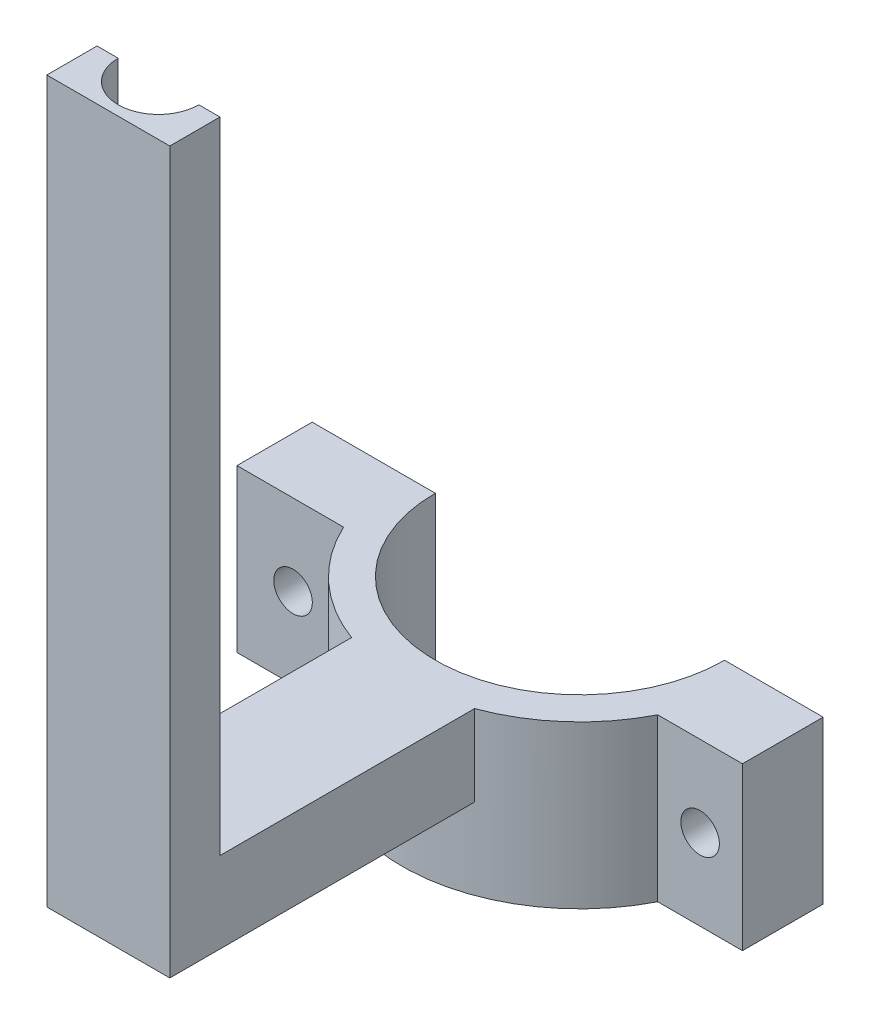
ISO-10303-21;
HEADER;
FILE_DESCRIPTION(('STEP AP214'),'2;1');
FILE_NAME('part.step','',(''),(''),'','','');
FILE_SCHEMA(('AUTOMOTIVE_DESIGN { 1 0 10303 214 1 1 1 1 }'));
ENDSEC;
DATA;
#1=APPLICATION_CONTEXT('core data for automotive mechanical design processes');
#2=APPLICATION_PROTOCOL_DEFINITION('international standard','automotive_design',2000,#1);
#3=PRODUCT_CONTEXT('',#1,'mechanical');
#4=PRODUCT('Part','Part','',(#3));
#5=PRODUCT_RELATED_PRODUCT_CATEGORY('part','',(#4));
#6=PRODUCT_DEFINITION_FORMATION('','',#4);
#7=PRODUCT_DEFINITION_CONTEXT('part definition',#1,'design');
#8=PRODUCT_DEFINITION('design','',#6,#7);
#9=PRODUCT_DEFINITION_SHAPE('','',#8);
#10=(LENGTH_UNIT() NAMED_UNIT(*) SI_UNIT(.MILLI.,.METRE.));
#11=(NAMED_UNIT(*) PLANE_ANGLE_UNIT() SI_UNIT($,.RADIAN.));
#12=(NAMED_UNIT(*) SI_UNIT($,.STERADIAN.) SOLID_ANGLE_UNIT());
#13=UNCERTAINTY_MEASURE_WITH_UNIT(LENGTH_MEASURE(1.E-05),#10,'distance_accuracy_value','');
#14=(GEOMETRIC_REPRESENTATION_CONTEXT(3) GLOBAL_UNCERTAINTY_ASSIGNED_CONTEXT((#13)) GLOBAL_UNIT_ASSIGNED_CONTEXT((#10,
#11,#12)) REPRESENTATION_CONTEXT('',''));
#15=CARTESIAN_POINT('',(0.,0.,0.));
#16=DIRECTION('',(0.,0.,1.));
#17=DIRECTION('',(1.,0.,0.));
#18=AXIS2_PLACEMENT_3D('',#15,#16,#17);
#19=CARTESIAN_POINT('',(0.,16.05,0.));
#20=DIRECTION('',(0.,-1.,0.));
#21=DIRECTION('',(0.,0.,-1.));
#22=AXIS2_PLACEMENT_3D('',#19,#20,#21);
#23=CYLINDRICAL_SURFACE('',#22,17.63);
#24=CARTESIAN_POINT('',(0.,16.05,0.));
#25=DIRECTION('',(0.,1.,0.));
#26=DIRECTION('',(1.,0.,0.));
#27=AXIS2_PLACEMENT_3D('',#24,#25,#26);
#28=CIRCLE('',#27,17.63);
#29=CARTESIAN_POINT('',(-15.9755493799721,16.05,7.45645505639727));
#30=VERTEX_POINT('',#29);
#31=CARTESIAN_POINT('',(-6.095,16.05,16.5429101127945));
#32=VERTEX_POINT('',#31);
#33=EDGE_CURVE('E255',#30,#32,#28,.T.);
#34=ORIENTED_EDGE('',*,*,#33,.F.);
#35=DIRECTION('',(0.,-1.,0.));
#36=VECTOR('',#35,1.);
#37=CARTESIAN_POINT('',(-15.9755493799721,16.05,7.45645505639727));
#38=LINE('',#37,#36);
#39=CARTESIAN_POINT('',(-15.9755493799721,0.,7.45645505639727));
#40=VERTEX_POINT('',#39);
#41=EDGE_CURVE('E272',#30,#40,#38,.T.);
#42=ORIENTED_EDGE('',*,*,#41,.T.);
#43=CARTESIAN_POINT('',(0.,0.,0.));
#44=DIRECTION('',(0.,1.,0.));
#45=DIRECTION('',(1.,0.,0.));
#46=AXIS2_PLACEMENT_3D('',#43,#44,#45);
#47=CIRCLE('',#46,17.63);
#48=CARTESIAN_POINT('',(15.7104073785501,0.,8.));
#49=VERTEX_POINT('',#48);
#50=EDGE_CURVE('E252',#40,#49,#47,.T.);
#51=ORIENTED_EDGE('',*,*,#50,.T.);
#52=DIRECTION('',(0.,-1.,0.));
#53=VECTOR('',#52,1.);
#54=CARTESIAN_POINT('',(15.7104073785501,16.05,8.));
#55=LINE('',#54,#53);
#56=CARTESIAN_POINT('',(15.7104073785501,16.05,8.));
#57=VERTEX_POINT('',#56);
#58=EDGE_CURVE('E258',#49,#57,#55,.F.);
#59=ORIENTED_EDGE('',*,*,#58,.T.);
#60=CARTESIAN_POINT('',(6.095,16.05,16.5429101127945));
#61=VERTEX_POINT('',#60);
#62=EDGE_CURVE('E259',#61,#57,#28,.T.);
#63=ORIENTED_EDGE('',*,*,#62,.F.);
#64=DIRECTION('',(0.,-1.,0.));
#65=VECTOR('',#64,1.);
#66=CARTESIAN_POINT('',(6.095,16.05,16.5429101127945));
#67=LINE('',#66,#65);
#68=CARTESIAN_POINT('',(6.095,8.025,16.5429101127945));
#69=VERTEX_POINT('',#68);
#70=EDGE_CURVE('E269',#61,#69,#67,.T.);
#71=ORIENTED_EDGE('',*,*,#70,.T.);
#72=CARTESIAN_POINT('',(0.,8.025,0.));
#73=DIRECTION('',(0.,-1.,0.));
#74=DIRECTION('',(0.,0.,-1.));
#75=AXIS2_PLACEMENT_3D('',#72,#73,#74);
#76=CIRCLE('',#75,17.63);
#77=CARTESIAN_POINT('',(-6.095,8.025,16.5429101127945));
#78=VERTEX_POINT('',#77);
#79=EDGE_CURVE('E266',#69,#78,#76,.T.);
#80=ORIENTED_EDGE('',*,*,#79,.T.);
#81=DIRECTION('',(0.,-1.,0.));
#82=VECTOR('',#81,1.);
#83=CARTESIAN_POINT('',(-6.095,16.05,16.5429101127945));
#84=LINE('',#83,#82);
#85=EDGE_CURVE('E263',#78,#32,#84,.F.);
#86=ORIENTED_EDGE('',*,*,#85,.T.);
#87=EDGE_LOOP('',(#34,#42,#51,#59,#63,#71,#80,#86));
#88=FACE_BOUND('',#87,.T.);
#89=ADVANCED_FACE('F40',(#88),#23,.T.);
#90=CARTESIAN_POINT('',(0.,16.05,0.));
#91=DIRECTION('',(0.,1.,0.));
#92=DIRECTION('',(0.,0.,1.));
#93=AXIS2_PLACEMENT_3D('',#90,#91,#92);
#94=PLANE('',#93);
#95=ORIENTED_EDGE('',*,*,#33,.T.);
#96=DIRECTION('',(0.,0.,1.));
#97=VECTOR('',#96,1.);
#98=CARTESIAN_POINT('',(-6.095,16.05,14.98));
#99=LINE('',#98,#97);
#100=CARTESIAN_POINT('',(-6.095,16.05,41.7733725275192));
#101=VERTEX_POINT('',#100);
#102=EDGE_CURVE('E282',#32,#101,#99,.T.);
#103=ORIENTED_EDGE('',*,*,#102,.T.);
#104=DIRECTION('',(-1.,0.,0.));
#105=VECTOR('',#104,1.);
#106=CARTESIAN_POINT('',(18.905,16.05,41.7733725275192));
#107=LINE('',#106,#105);
#108=CARTESIAN_POINT('',(6.095,16.05,41.7733725275192));
#109=VERTEX_POINT('',#108);
#110=EDGE_CURVE('E170',#109,#101,#107,.T.);
#111=ORIENTED_EDGE('',*,*,#110,.F.);
#112=DIRECTION('',(0.,0.,-1.));
#113=VECTOR('',#112,1.);
#114=CARTESIAN_POINT('',(6.095,16.05,14.98));
#115=LINE('',#114,#113);
#116=EDGE_CURVE('E168',#109,#61,#115,.T.);
#117=ORIENTED_EDGE('',*,*,#116,.T.);
#118=ORIENTED_EDGE('',*,*,#62,.T.);
#119=DIRECTION('',(1.,0.,0.));
#120=VECTOR('',#119,1.);
#121=CARTESIAN_POINT('',(14.75,16.05,8.));
#122=LINE('',#121,#120);
#123=CARTESIAN_POINT('',(24.11,16.05,8.));
#124=VERTEX_POINT('',#123);
#125=EDGE_CURVE('E242',#57,#124,#122,.T.);
#126=ORIENTED_EDGE('',*,*,#125,.T.);
#127=DIRECTION('',(0.,0.,1.));
#128=VECTOR('',#127,1.);
#129=CARTESIAN_POINT('',(24.11,16.05,-8.));
#130=LINE('',#129,#128);
#131=CARTESIAN_POINT('',(24.11,16.05,0.));
#132=VERTEX_POINT('',#131);
#133=EDGE_CURVE('E235',#132,#124,#130,.T.);
#134=ORIENTED_EDGE('',*,*,#133,.F.);
#135=DIRECTION('',(1.,0.,0.));
#136=VECTOR('',#135,1.);
#137=CARTESIAN_POINT('',(24.11,16.05,0.));
#138=LINE('',#137,#136);
#139=CARTESIAN_POINT('',(14.34,16.05,0.));
#140=VERTEX_POINT('',#139);
#141=EDGE_CURVE('E189',#140,#132,#138,.T.);
#142=ORIENTED_EDGE('',*,*,#141,.F.);
#143=CARTESIAN_POINT('',(0.,16.05,0.));
#144=DIRECTION('',(0.,1.,0.));
#145=DIRECTION('',(0.,0.,1.));
#146=AXIS2_PLACEMENT_3D('',#143,#144,#145);
#147=CIRCLE('',#146,14.34);
#148=CARTESIAN_POINT('',(-14.34,16.05,0.));
#149=VERTEX_POINT('',#148);
#150=EDGE_CURVE('E249',#149,#140,#147,.T.);
#151=ORIENTED_EDGE('',*,*,#150,.F.);
#152=CARTESIAN_POINT('',(-26.54,16.05,0.));
#153=VERTEX_POINT('',#152);
#154=EDGE_CURVE('E194',#153,#149,#138,.T.);
#155=ORIENTED_EDGE('',*,*,#154,.F.);
#156=DIRECTION('',(0.,0.,-1.));
#157=VECTOR('',#156,1.);
#158=CARTESIAN_POINT('',(-26.54,16.05,-8.54354494360273));
#159=LINE('',#158,#157);
#160=CARTESIAN_POINT('',(-26.54,16.05,7.45645505639727));
#161=VERTEX_POINT('',#160);
#162=EDGE_CURVE('E213',#161,#153,#159,.T.);
#163=ORIENTED_EDGE('',*,*,#162,.F.);
#164=DIRECTION('',(1.,0.,0.));
#165=VECTOR('',#164,1.);
#166=CARTESIAN_POINT('',(-27.75,16.05,7.45645505639727));
#167=LINE('',#166,#165);
#168=EDGE_CURVE('E222',#161,#30,#167,.T.);
#169=ORIENTED_EDGE('',*,*,#168,.T.);
#170=EDGE_LOOP('',(#95,#103,#111,#117,#118,#126,#134,#142,#151,#155,#163,#169));
#171=FACE_BOUND('',#170,.T.);
#172=ADVANCED_FACE('F295',(#171),#94,.T.);
#173=CARTESIAN_POINT('',(0.,0.,0.));
#174=DIRECTION('',(0.,1.,0.));
#175=DIRECTION('',(0.,0.,1.));
#176=AXIS2_PLACEMENT_3D('',#173,#174,#175);
#177=PLANE('',#176);
#178=DIRECTION('',(0.,0.,-1.));
#179=VECTOR('',#178,1.);
#180=CARTESIAN_POINT('',(-26.54,0.,-8.54354494360273));
#181=LINE('',#180,#179);
#182=CARTESIAN_POINT('',(-26.54,0.,7.45645505639727));
#183=VERTEX_POINT('',#182);
#184=CARTESIAN_POINT('',(-26.54,0.,0.));
#185=VERTEX_POINT('',#184);
#186=EDGE_CURVE('E214',#183,#185,#181,.T.);
#187=ORIENTED_EDGE('',*,*,#186,.T.);
#188=DIRECTION('',(1.,0.,0.));
#189=VECTOR('',#188,1.);
#190=CARTESIAN_POINT('',(24.11,0.,0.));
#191=LINE('',#190,#189);
#192=CARTESIAN_POINT('',(-14.34,0.,0.));
#193=VERTEX_POINT('',#192);
#194=EDGE_CURVE('E193',#185,#193,#191,.T.);
#195=ORIENTED_EDGE('',*,*,#194,.T.);
#196=CARTESIAN_POINT('',(0.,0.,0.));
#197=DIRECTION('',(0.,1.,0.));
#198=DIRECTION('',(0.,0.,1.));
#199=AXIS2_PLACEMENT_3D('',#196,#197,#198);
#200=CIRCLE('',#199,14.34);
#201=CARTESIAN_POINT('',(14.34,0.,0.));
#202=VERTEX_POINT('',#201);
#203=EDGE_CURVE('E246',#193,#202,#200,.T.);
#204=ORIENTED_EDGE('',*,*,#203,.T.);
#205=CARTESIAN_POINT('',(24.11,0.,0.));
#206=VERTEX_POINT('',#205);
#207=EDGE_CURVE('E190',#202,#206,#191,.T.);
#208=ORIENTED_EDGE('',*,*,#207,.T.);
#209=DIRECTION('',(0.,0.,1.));
#210=VECTOR('',#209,1.);
#211=CARTESIAN_POINT('',(24.11,0.,-8.));
#212=LINE('',#211,#210);
#213=CARTESIAN_POINT('',(24.11,0.,8.));
#214=VERTEX_POINT('',#213);
#215=EDGE_CURVE('E236',#206,#214,#212,.T.);
#216=ORIENTED_EDGE('',*,*,#215,.T.);
#217=DIRECTION('',(1.,0.,0.));
#218=VECTOR('',#217,1.);
#219=CARTESIAN_POINT('',(14.75,0.,8.));
#220=LINE('',#219,#218);
#221=EDGE_CURVE('E243',#49,#214,#220,.T.);
#222=ORIENTED_EDGE('',*,*,#221,.F.);
#223=ORIENTED_EDGE('',*,*,#50,.F.);
#224=DIRECTION('',(1.,0.,0.));
#225=VECTOR('',#224,1.);
#226=CARTESIAN_POINT('',(-27.75,0.,7.45645505639727));
#227=LINE('',#226,#225);
#228=EDGE_CURVE('E221',#183,#40,#227,.T.);
#229=ORIENTED_EDGE('',*,*,#228,.F.);
#230=EDGE_LOOP('',(#187,#195,#204,#208,#216,#222,#223,#229));
#231=FACE_BOUND('',#230,.T.);
#232=ADVANCED_FACE('F327',(#231),#177,.F.);
#233=CARTESIAN_POINT('',(0.,16.05,0.));
#234=DIRECTION('',(0.,-1.,0.));
#235=DIRECTION('',(0.,0.,-1.));
#236=AXIS2_PLACEMENT_3D('',#233,#234,#235);
#237=CYLINDRICAL_SURFACE('',#236,14.34);
#238=DIRECTION('',(0.,-1.,0.));
#239=VECTOR('',#238,1.);
#240=CARTESIAN_POINT('',(-14.34,16.05,0.));
#241=LINE('',#240,#239);
#242=EDGE_CURVE('E208',#149,#193,#241,.T.);
#243=ORIENTED_EDGE('',*,*,#242,.F.);
#244=ORIENTED_EDGE('',*,*,#150,.T.);
#245=DIRECTION('',(0.,-1.,0.));
#246=VECTOR('',#245,1.);
#247=CARTESIAN_POINT('',(14.34,16.05,0.));
#248=LINE('',#247,#246);
#249=EDGE_CURVE('E206',#202,#140,#248,.F.);
#250=ORIENTED_EDGE('',*,*,#249,.F.);
#251=ORIENTED_EDGE('',*,*,#203,.F.);
#252=EDGE_LOOP('',(#243,#244,#250,#251));
#253=FACE_BOUND('',#252,.T.);
#254=ADVANCED_FACE('F320',(#253),#237,.F.);
#255=CARTESIAN_POINT('',(14.75,16.05,8.));
#256=DIRECTION('',(0.,0.,1.));
#257=DIRECTION('',(1.,0.,0.));
#258=AXIS2_PLACEMENT_3D('',#255,#256,#257);
#259=PLANE('',#258);
#260=CARTESIAN_POINT('',(19.9102036892766,8.02500000000175,8.));
#261=DIRECTION('',(0.,0.,1.));
#262=DIRECTION('',(1.,0.,0.));
#263=AXIS2_PLACEMENT_3D('',#260,#261,#262);
#264=CIRCLE('',#263,1.91);
#265=CARTESIAN_POINT('',(21.8202036892766,8.02500000000175,8.));
#266=VERTEX_POINT('',#265);
#267=EDGE_CURVE('E231',#266,#266,#264,.T.);
#268=ORIENTED_EDGE('',*,*,#267,.F.);
#269=EDGE_LOOP('',(#268));
#270=FACE_BOUND('',#269,.T.);
#271=DIRECTION('',(0.,1.,0.));
#272=VECTOR('',#271,1.);
#273=CARTESIAN_POINT('',(24.11,0.,8.));
#274=LINE('',#273,#272);
#275=EDGE_CURVE('E238',#214,#124,#274,.T.);
#276=ORIENTED_EDGE('',*,*,#275,.T.);
#277=ORIENTED_EDGE('',*,*,#125,.F.);
#278=ORIENTED_EDGE('',*,*,#58,.F.);
#279=ORIENTED_EDGE('',*,*,#221,.T.);
#280=EDGE_LOOP('',(#276,#277,#278,#279));
#281=FACE_BOUND('',#280,.T.);
#282=ADVANCED_FACE('F307',(#270,#281),#259,.T.);
#283=CARTESIAN_POINT('',(24.11,0.,-8.));
#284=DIRECTION('',(-1.,0.,0.));
#285=DIRECTION('',(0.,0.,1.));
#286=AXIS2_PLACEMENT_3D('',#283,#284,#285);
#287=PLANE('',#286);
#288=ORIENTED_EDGE('',*,*,#215,.F.);
#289=DIRECTION('',(0.,1.,0.));
#290=VECTOR('',#289,1.);
#291=CARTESIAN_POINT('',(24.11,0.,0.));
#292=LINE('',#291,#290);
#293=EDGE_CURVE('E196',#206,#132,#292,.T.);
#294=ORIENTED_EDGE('',*,*,#293,.T.);
#295=ORIENTED_EDGE('',*,*,#133,.T.);
#296=ORIENTED_EDGE('',*,*,#275,.F.);
#297=EDGE_LOOP('',(#288,#294,#295,#296));
#298=FACE_BOUND('',#297,.T.);
#299=ADVANCED_FACE('F312',(#298),#287,.F.);
#300=CARTESIAN_POINT('',(19.9102036892766,8.02500000000175,-17.63));
#301=DIRECTION('',(0.,0.,1.));
#302=DIRECTION('',(1.,0.,0.));
#303=AXIS2_PLACEMENT_3D('',#300,#301,#302);
#304=CYLINDRICAL_SURFACE('',#303,1.91);
#305=CARTESIAN_POINT('',(19.9102036892766,8.02500000000175,0.));
#306=DIRECTION('',(0.,0.,1.));
#307=DIRECTION('',(1.,0.,0.));
#308=AXIS2_PLACEMENT_3D('',#305,#306,#307);
#309=CIRCLE('',#308,1.91);
#310=CARTESIAN_POINT('',(21.8202036892766,8.02500000000175,0.));
#311=VERTEX_POINT('',#310);
#312=EDGE_CURVE('E203',#311,#311,#309,.F.);
#313=ORIENTED_EDGE('',*,*,#312,.T.);
#314=EDGE_LOOP('',(#313));
#315=FACE_BOUND('',#314,.T.);
#316=ORIENTED_EDGE('',*,*,#267,.T.);
#317=EDGE_LOOP('',(#316));
#318=FACE_BOUND('',#317,.T.);
#319=ADVANCED_FACE('F344',(#315,#318),#304,.F.);
#320=CARTESIAN_POINT('',(6.095,16.2886259485937,14.98));
#321=DIRECTION('',(1.,0.,0.));
#322=DIRECTION('',(0.,1.,0.));
#323=AXIS2_PLACEMENT_3D('',#320,#321,#322);
#324=PLANE('',#323);
#325=DIRECTION('',(0.,-1.,0.));
#326=VECTOR('',#325,1.);
#327=CARTESIAN_POINT('',(6.095,16.2886259485937,41.7733725275192));
#328=LINE('',#327,#326);
#329=CARTESIAN_POINT('',(6.095,79.4486259485936,41.7733725275192));
#330=VERTEX_POINT('',#329);
#331=EDGE_CURVE('E166',#330,#109,#328,.T.);
#332=ORIENTED_EDGE('',*,*,#331,.F.);
#333=DIRECTION('',(0.,0.,-1.));
#334=VECTOR('',#333,1.);
#335=CARTESIAN_POINT('',(6.095,79.4486259485936,21.75));
#336=LINE('',#335,#334);
#337=CARTESIAN_POINT('',(6.095,79.4486259485936,46.75));
#338=VERTEX_POINT('',#337);
#339=EDGE_CURVE('E165',#338,#330,#336,.T.);
#340=ORIENTED_EDGE('',*,*,#339,.F.);
#341=DIRECTION('',(0.,1.,0.));
#342=VECTOR('',#341,1.);
#343=CARTESIAN_POINT('',(6.095,8.025,46.75));
#344=LINE('',#343,#342);
#345=CARTESIAN_POINT('',(6.095,8.025,46.75));
#346=VERTEX_POINT('',#345);
#347=EDGE_CURVE('E183',#346,#338,#344,.T.);
#348=ORIENTED_EDGE('',*,*,#347,.F.);
#349=DIRECTION('',(0.,0.,1.));
#350=VECTOR('',#349,1.);
#351=CARTESIAN_POINT('',(6.095,8.025,14.98));
#352=LINE('',#351,#350);
#353=EDGE_CURVE('E229',#69,#346,#352,.T.);
#354=ORIENTED_EDGE('',*,*,#353,.F.);
#355=ORIENTED_EDGE('',*,*,#70,.F.);
#356=ORIENTED_EDGE('',*,*,#116,.F.);
#357=EDGE_LOOP('',(#332,#340,#348,#354,#355,#356));
#358=FACE_BOUND('',#357,.T.);
#359=ADVANCED_FACE('F291',(#358),#324,.T.);
#360=CARTESIAN_POINT('',(-6.095,8.025,14.98));
#361=DIRECTION('',(0.,-1.,0.));
#362=DIRECTION('',(0.,0.,-1.));
#363=AXIS2_PLACEMENT_3D('',#360,#361,#362);
#364=PLANE('',#363);
#365=ORIENTED_EDGE('',*,*,#79,.F.);
#366=ORIENTED_EDGE('',*,*,#353,.T.);
#367=DIRECTION('',(1.,0.,0.));
#368=VECTOR('',#367,1.);
#369=CARTESIAN_POINT('',(-6.095,8.025,46.75));
#370=LINE('',#369,#368);
#371=CARTESIAN_POINT('',(-6.095,8.025,46.75));
#372=VERTEX_POINT('',#371);
#373=EDGE_CURVE('E180',#372,#346,#370,.T.);
#374=ORIENTED_EDGE('',*,*,#373,.F.);
#375=DIRECTION('',(0.,0.,1.));
#376=VECTOR('',#375,1.);
#377=CARTESIAN_POINT('',(-6.095,8.025,14.98));
#378=LINE('',#377,#376);
#379=EDGE_CURVE('E228',#78,#372,#378,.T.);
#380=ORIENTED_EDGE('',*,*,#379,.F.);
#381=EDGE_LOOP('',(#365,#366,#374,#380));
#382=FACE_BOUND('',#381,.T.);
#383=ADVANCED_FACE('F301',(#382),#364,.T.);
#384=CARTESIAN_POINT('',(-6.095,16.2886259485937,14.98));
#385=DIRECTION('',(-1.,0.,0.));
#386=DIRECTION('',(0.,-1.,0.));
#387=AXIS2_PLACEMENT_3D('',#384,#385,#386);
#388=PLANE('',#387);
#389=DIRECTION('',(0.,1.,0.));
#390=VECTOR('',#389,1.);
#391=CARTESIAN_POINT('',(-6.095,16.05,41.7733725275192));
#392=LINE('',#391,#390);
#393=CARTESIAN_POINT('',(-6.095,79.4486259485936,41.7733725275192));
#394=VERTEX_POINT('',#393);
#395=EDGE_CURVE('E173',#101,#394,#392,.T.);
#396=ORIENTED_EDGE('',*,*,#395,.F.);
#397=ORIENTED_EDGE('',*,*,#102,.F.);
#398=ORIENTED_EDGE('',*,*,#85,.F.);
#399=ORIENTED_EDGE('',*,*,#379,.T.);
#400=DIRECTION('',(0.,-1.,0.));
#401=VECTOR('',#400,1.);
#402=CARTESIAN_POINT('',(-6.095,8.025,46.75));
#403=LINE('',#402,#401);
#404=CARTESIAN_POINT('',(-6.095,79.4486259485936,46.75));
#405=VERTEX_POINT('',#404);
#406=EDGE_CURVE('E177',#405,#372,#403,.T.);
#407=ORIENTED_EDGE('',*,*,#406,.F.);
#408=DIRECTION('',(0.,0.,1.));
#409=VECTOR('',#408,1.);
#410=CARTESIAN_POINT('',(-6.095,79.4486259485936,21.75));
#411=LINE('',#410,#409);
#412=EDGE_CURVE('E224',#394,#405,#411,.T.);
#413=ORIENTED_EDGE('',*,*,#412,.F.);
#414=EDGE_LOOP('',(#396,#397,#398,#399,#407,#413));
#415=FACE_BOUND('',#414,.T.);
#416=ADVANCED_FACE('F284',(#415),#388,.T.);
#417=CARTESIAN_POINT('',(0.,79.4486259485936,0.));
#418=DIRECTION('',(0.,-1.,0.));
#419=DIRECTION('',(0.,0.,-1.));
#420=AXIS2_PLACEMENT_3D('',#417,#418,#419);
#421=PLANE('',#420);
#422=DIRECTION('',(-1.,0.,0.));
#423=VECTOR('',#422,1.);
#424=CARTESIAN_POINT('',(18.905,79.4486259485936,41.7733725275192));
#425=LINE('',#424,#423);
#426=CARTESIAN_POINT('',(4.,79.4486259485936,41.7733725275192));
#427=VERTEX_POINT('',#426);
#428=EDGE_CURVE('E159',#330,#427,#425,.T.);
#429=ORIENTED_EDGE('',*,*,#428,.T.);
#430=CARTESIAN_POINT('',(0.,79.4486259485936,41.7733725275192));
#431=DIRECTION('',(0.,1.,0.));
#432=DIRECTION('',(0.,0.,1.));
#433=AXIS2_PLACEMENT_3D('',#430,#431,#432);
#434=CIRCLE('',#433,4.);
#435=CARTESIAN_POINT('',(-4.,79.4486259485936,41.7733725275192));
#436=VERTEX_POINT('',#435);
#437=EDGE_CURVE('E151',#436,#427,#434,.T.);
#438=ORIENTED_EDGE('',*,*,#437,.F.);
#439=EDGE_CURVE('E61',#436,#394,#425,.T.);
#440=ORIENTED_EDGE('',*,*,#439,.T.);
#441=ORIENTED_EDGE('',*,*,#412,.T.);
#442=DIRECTION('',(-1.,0.,0.));
#443=VECTOR('',#442,1.);
#444=CARTESIAN_POINT('',(-6.095,79.4486259485936,46.75));
#445=LINE('',#444,#443);
#446=EDGE_CURVE('E186',#338,#405,#445,.T.);
#447=ORIENTED_EDGE('',*,*,#446,.F.);
#448=ORIENTED_EDGE('',*,*,#339,.T.);
#449=EDGE_LOOP('',(#429,#438,#440,#441,#447,#448));
#450=FACE_BOUND('',#449,.T.);
#451=ADVANCED_FACE('F163',(#450),#421,.F.);
#452=CARTESIAN_POINT('',(-27.75,16.05,7.45645505639727));
#453=DIRECTION('',(0.,0.,1.));
#454=DIRECTION('',(1.,0.,0.));
#455=AXIS2_PLACEMENT_3D('',#452,#453,#454);
#456=PLANE('',#455);
#457=CARTESIAN_POINT('',(-20.9807836793096,8.02500000000175,7.45645505639727));
#458=DIRECTION('',(0.,0.,1.));
#459=DIRECTION('',(1.,0.,0.));
#460=AXIS2_PLACEMENT_3D('',#457,#458,#459);
#461=CIRCLE('',#460,1.91);
#462=CARTESIAN_POINT('',(-19.0707836793096,8.02500000000175,7.45645505639727));
#463=VERTEX_POINT('',#462);
#464=EDGE_CURVE('E210',#463,#463,#461,.T.);
#465=ORIENTED_EDGE('',*,*,#464,.F.);
#466=EDGE_LOOP('',(#465));
#467=FACE_BOUND('',#466,.T.);
#468=DIRECTION('',(0.,1.,0.));
#469=VECTOR('',#468,1.);
#470=CARTESIAN_POINT('',(-26.54,0.,7.45645505639727));
#471=LINE('',#470,#469);
#472=EDGE_CURVE('E217',#183,#161,#471,.T.);
#473=ORIENTED_EDGE('',*,*,#472,.F.);
#474=ORIENTED_EDGE('',*,*,#228,.T.);
#475=ORIENTED_EDGE('',*,*,#41,.F.);
#476=ORIENTED_EDGE('',*,*,#168,.F.);
#477=EDGE_LOOP('',(#473,#474,#475,#476));
#478=FACE_BOUND('',#477,.T.);
#479=ADVANCED_FACE('F336',(#467,#478),#456,.T.);
#480=CARTESIAN_POINT('',(-26.54,0.,-8.54354494360273));
#481=DIRECTION('',(1.,0.,0.));
#482=DIRECTION('',(0.,0.,-1.));
#483=AXIS2_PLACEMENT_3D('',#480,#481,#482);
#484=PLANE('',#483);
#485=ORIENTED_EDGE('',*,*,#162,.T.);
#486=DIRECTION('',(0.,-1.,0.));
#487=VECTOR('',#486,1.);
#488=CARTESIAN_POINT('',(-26.54,0.,0.));
#489=LINE('',#488,#487);
#490=EDGE_CURVE('E200',#153,#185,#489,.T.);
#491=ORIENTED_EDGE('',*,*,#490,.T.);
#492=ORIENTED_EDGE('',*,*,#186,.F.);
#493=ORIENTED_EDGE('',*,*,#472,.T.);
#494=EDGE_LOOP('',(#485,#491,#492,#493));
#495=FACE_BOUND('',#494,.T.);
#496=ADVANCED_FACE('F332',(#495),#484,.F.);
#497=CARTESIAN_POINT('',(-20.9807836793096,8.02500000000176,21.75));
#498=DIRECTION('',(0.,0.,-1.));
#499=DIRECTION('',(0.,1.,0.));
#500=AXIS2_PLACEMENT_3D('',#497,#498,#499);
#501=CYLINDRICAL_SURFACE('',#500,1.91);
#502=CARTESIAN_POINT('',(-20.9807836793096,8.02500000000175,0.));
#503=DIRECTION('',(0.,0.,1.));
#504=DIRECTION('',(1.,0.,0.));
#505=AXIS2_PLACEMENT_3D('',#502,#503,#504);
#506=CIRCLE('',#505,1.91);
#507=CARTESIAN_POINT('',(-19.0707836793096,8.02500000000175,0.));
#508=VERTEX_POINT('',#507);
#509=EDGE_CURVE('E199',#508,#508,#506,.F.);
#510=ORIENTED_EDGE('',*,*,#509,.T.);
#511=EDGE_LOOP('',(#510));
#512=FACE_BOUND('',#511,.T.);
#513=ORIENTED_EDGE('',*,*,#464,.T.);
#514=EDGE_LOOP('',(#513));
#515=FACE_BOUND('',#514,.T.);
#516=ADVANCED_FACE('F393',(#512,#515),#501,.F.);
#517=CARTESIAN_POINT('',(24.11,0.,0.));
#518=DIRECTION('',(0.,0.,1.));
#519=DIRECTION('',(1.,0.,0.));
#520=AXIS2_PLACEMENT_3D('',#517,#518,#519);
#521=PLANE('',#520);
#522=ORIENTED_EDGE('',*,*,#242,.T.);
#523=ORIENTED_EDGE('',*,*,#194,.F.);
#524=ORIENTED_EDGE('',*,*,#490,.F.);
#525=ORIENTED_EDGE('',*,*,#154,.T.);
#526=EDGE_LOOP('',(#522,#523,#524,#525));
#527=FACE_BOUND('',#526,.T.);
#528=ORIENTED_EDGE('',*,*,#509,.F.);
#529=EDGE_LOOP('',(#528));
#530=FACE_BOUND('',#529,.T.);
#531=ADVANCED_FACE('F324',(#527,#530),#521,.F.);
#532=ORIENTED_EDGE('',*,*,#249,.T.);
#533=ORIENTED_EDGE('',*,*,#141,.T.);
#534=ORIENTED_EDGE('',*,*,#293,.F.);
#535=ORIENTED_EDGE('',*,*,#207,.F.);
#536=EDGE_LOOP('',(#532,#533,#534,#535));
#537=FACE_BOUND('',#536,.T.);
#538=ORIENTED_EDGE('',*,*,#312,.F.);
#539=EDGE_LOOP('',(#538));
#540=FACE_BOUND('',#539,.T.);
#541=ADVANCED_FACE('F338',(#537,#540),#521,.F.);
#542=CARTESIAN_POINT('',(0.,0.,46.75));
#543=DIRECTION('',(0.,0.,-1.));
#544=DIRECTION('',(-1.,0.,0.));
#545=AXIS2_PLACEMENT_3D('',#542,#543,#544);
#546=PLANE('',#545);
#547=ORIENTED_EDGE('',*,*,#406,.T.);
#548=ORIENTED_EDGE('',*,*,#373,.T.);
#549=ORIENTED_EDGE('',*,*,#347,.T.);
#550=ORIENTED_EDGE('',*,*,#446,.T.);
#551=EDGE_LOOP('',(#547,#548,#549,#550));
#552=FACE_BOUND('',#551,.T.);
#553=ADVANCED_FACE('F286',(#552),#546,.F.);
#554=CARTESIAN_POINT('',(18.905,16.05,41.7733725275192));
#555=DIRECTION('',(0.,0.,1.));
#556=DIRECTION('',(1.,0.,0.));
#557=AXIS2_PLACEMENT_3D('',#554,#555,#556);
#558=PLANE('',#557);
#559=DIRECTION('',(-1.,0.,0.));
#560=VECTOR('',#559,1.);
#561=CARTESIAN_POINT('',(18.905,55.4486259485937,41.7733725275192));
#562=LINE('',#561,#560);
#563=CARTESIAN_POINT('',(4.,55.4486259485937,41.7733725275192));
#564=VERTEX_POINT('',#563);
#565=CARTESIAN_POINT('',(-4.,55.4486259485936,41.7733725275192));
#566=VERTEX_POINT('',#565);
#567=EDGE_CURVE('E161',#564,#566,#562,.T.);
#568=ORIENTED_EDGE('',*,*,#567,.F.);
#569=DIRECTION('',(0.,1.,0.));
#570=VECTOR('',#569,1.);
#571=CARTESIAN_POINT('',(4.,55.4486259485936,41.7733725275192));
#572=LINE('',#571,#570);
#573=EDGE_CURVE('E12',#564,#427,#572,.T.);
#574=ORIENTED_EDGE('',*,*,#573,.T.);
#575=ORIENTED_EDGE('',*,*,#428,.F.);
#576=ORIENTED_EDGE('',*,*,#331,.T.);
#577=ORIENTED_EDGE('',*,*,#110,.T.);
#578=ORIENTED_EDGE('',*,*,#395,.T.);
#579=ORIENTED_EDGE('',*,*,#439,.F.);
#580=DIRECTION('',(0.,1.,0.));
#581=VECTOR('',#580,1.);
#582=CARTESIAN_POINT('',(-4.,55.4486259485936,41.7733725275192));
#583=LINE('',#582,#581);
#584=EDGE_CURVE('E47',#436,#566,#583,.F.);
#585=ORIENTED_EDGE('',*,*,#584,.T.);
#586=EDGE_LOOP('',(#568,#574,#575,#576,#577,#578,#579,#585));
#587=FACE_BOUND('',#586,.T.);
#588=ADVANCED_FACE('F158',(#587),#558,.F.);
#589=CARTESIAN_POINT('',(0.,55.4486259485936,41.7733725275192));
#590=DIRECTION('',(0.,1.,0.));
#591=DIRECTION('',(0.,0.,1.));
#592=AXIS2_PLACEMENT_3D('',#589,#590,#591);
#593=CYLINDRICAL_SURFACE('',#592,4.);
#594=CARTESIAN_POINT('',(0.,55.4486259485936,41.7733725275192));
#595=DIRECTION('',(0.,1.,0.));
#596=DIRECTION('',(0.,0.,1.));
#597=AXIS2_PLACEMENT_3D('',#594,#595,#596);
#598=CIRCLE('',#597,4.);
#599=EDGE_CURVE('E53',#566,#564,#598,.T.);
#600=ORIENTED_EDGE('',*,*,#599,.F.);
#601=ORIENTED_EDGE('',*,*,#584,.F.);
#602=ORIENTED_EDGE('',*,*,#437,.T.);
#603=ORIENTED_EDGE('',*,*,#573,.F.);
#604=EDGE_LOOP('',(#600,#601,#602,#603));
#605=FACE_BOUND('',#604,.T.);
#606=ADVANCED_FACE('F152',(#605),#593,.F.);
#607=CARTESIAN_POINT('',(0.,55.4486259485936,41.7733725275192));
#608=DIRECTION('',(0.,1.,0.));
#609=DIRECTION('',(0.,0.,1.));
#610=AXIS2_PLACEMENT_3D('',#607,#608,#609);
#611=PLANE('',#610);
#612=ORIENTED_EDGE('',*,*,#567,.T.);
#613=ORIENTED_EDGE('',*,*,#599,.T.);
#614=EDGE_LOOP('',(#612,#613));
#615=FACE_BOUND('',#614,.T.);
#616=ADVANCED_FACE('F448',(#615),#611,.T.);
#617=CLOSED_SHELL('',(#89,#172,#232,#254,#282,#299,#319,#359,#383,#416,#451,#479,#496,#516,#531,
#541,#553,#588,#606,#616));
#618=MANIFOLD_SOLID_BREP('B2',#617);
#619=ADVANCED_BREP_SHAPE_REPRESENTATION('',(#18,#618),#14);
#620=SHAPE_DEFINITION_REPRESENTATION(#9,#619);
ENDSEC;
END-ISO-10303-21;
